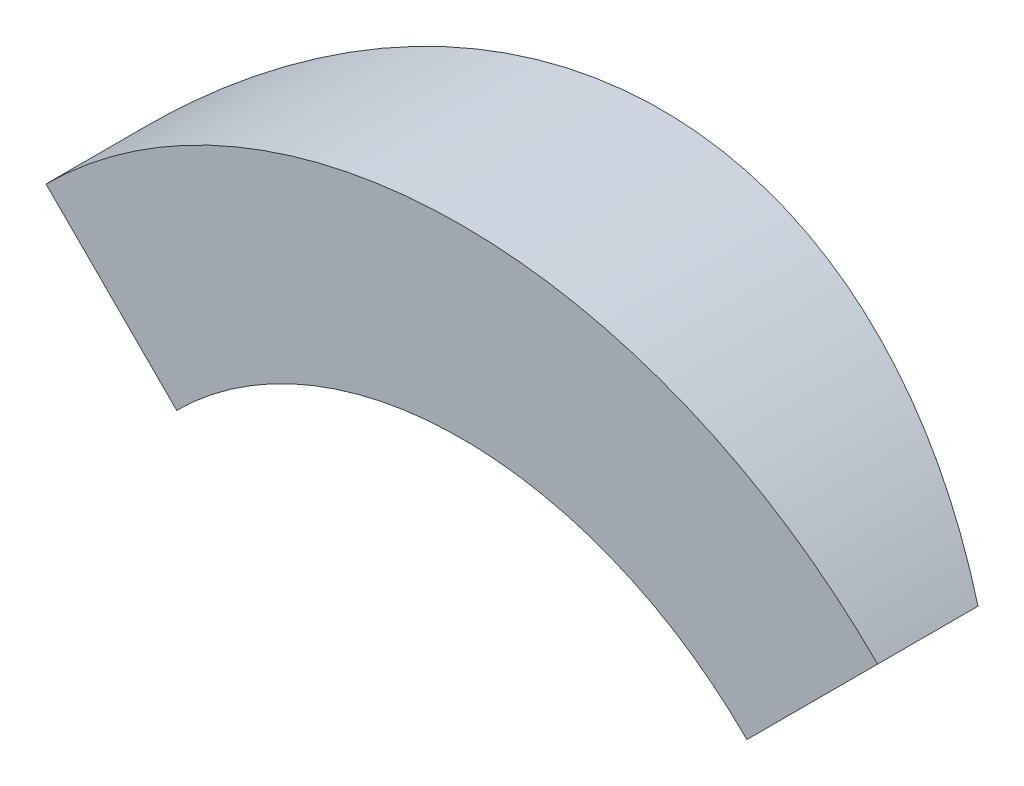
ISO-10303-21;
HEADER;
FILE_DESCRIPTION(('STEP AP214'),'2;1');
FILE_NAME('part.step','',(''),(''),'','','');
FILE_SCHEMA(('AUTOMOTIVE_DESIGN { 1 0 10303 214 1 1 1 1 }'));
ENDSEC;
DATA;
#1=APPLICATION_CONTEXT('core data for automotive mechanical design processes');
#2=APPLICATION_PROTOCOL_DEFINITION('international standard','automotive_design',2000,#1);
#3=PRODUCT_CONTEXT('',#1,'mechanical');
#4=PRODUCT('Part','Part','',(#3));
#5=PRODUCT_RELATED_PRODUCT_CATEGORY('part','',(#4));
#6=PRODUCT_DEFINITION_FORMATION('','',#4);
#7=PRODUCT_DEFINITION_CONTEXT('part definition',#1,'design');
#8=PRODUCT_DEFINITION('design','',#6,#7);
#9=PRODUCT_DEFINITION_SHAPE('','',#8);
#10=(LENGTH_UNIT() NAMED_UNIT(*) SI_UNIT(.MILLI.,.METRE.));
#11=(NAMED_UNIT(*) PLANE_ANGLE_UNIT() SI_UNIT($,.RADIAN.));
#12=(NAMED_UNIT(*) SI_UNIT($,.STERADIAN.) SOLID_ANGLE_UNIT());
#13=UNCERTAINTY_MEASURE_WITH_UNIT(LENGTH_MEASURE(1.E-05),#10,'distance_accuracy_value','');
#14=(GEOMETRIC_REPRESENTATION_CONTEXT(3) GLOBAL_UNCERTAINTY_ASSIGNED_CONTEXT((#13)) GLOBAL_UNIT_ASSIGNED_CONTEXT((#10,
#11,#12)) REPRESENTATION_CONTEXT('',''));
#15=CARTESIAN_POINT('',(0.,0.,0.));
#16=DIRECTION('',(0.,0.,1.));
#17=DIRECTION('',(1.,0.,0.));
#18=AXIS2_PLACEMENT_3D('',#15,#16,#17);
#19=CARTESIAN_POINT('',(0.,1.8,3.11769145362398));
#20=DIRECTION('',(0.,0.500000000000001,0.866025403784438));
#21=DIRECTION('',(0.,-0.866025403784438,0.500000000000001));
#22=AXIS2_PLACEMENT_3D('',#19,#20,#21);
#23=PLANE('',#22);
#24=CARTESIAN_POINT('',(0.,0.,4.1569219381653));
#25=DIRECTION('',(0.,0.500000000000001,0.866025403784438));
#26=DIRECTION('',(0.,-0.866025403784438,0.500000000000001));
#27=AXIS2_PLACEMENT_3D('',#24,#25,#26);
#28=ELLIPSE('',#27,20.2072594216369,17.5);
#29=CARTESIAN_POINT('',(-12.3743686707646,12.3743686707646,-2.98742314495231));
#30=VERTEX_POINT('',#29);
#31=CARTESIAN_POINT('',(12.3743686707646,12.3743686707646,-2.98742314495231));
#32=VERTEX_POINT('',#31);
#33=EDGE_CURVE('E84',#30,#32,#28,.F.);
#34=ORIENTED_EDGE('',*,*,#33,.T.);
#35=DIRECTION('',(-0.654653670707977,-0.654653670707977,0.377964473009228));
#36=VECTOR('',#35,1.);
#37=CARTESIAN_POINT('',(1.02857142857143,1.02857142857143,3.56307594699883));
#38=LINE('',#37,#36);
#39=CARTESIAN_POINT('',(8.48528137423857,8.48528137423857,-0.742057547401059));
#40=VERTEX_POINT('',#39);
#41=EDGE_CURVE('E92',#32,#40,#38,.T.);
#42=ORIENTED_EDGE('',*,*,#41,.T.);
#43=CARTESIAN_POINT('',(0.,0.,4.1569219381653));
#44=DIRECTION('',(0.,0.500000000000001,0.866025403784438));
#45=DIRECTION('',(0.,-0.866025403784438,0.500000000000001));
#46=AXIS2_PLACEMENT_3D('',#43,#44,#45);
#47=ELLIPSE('',#46,13.856406460551,12.);
#48=CARTESIAN_POINT('',(-8.48528137423857,8.48528137423857,-0.742057547401059));
#49=VERTEX_POINT('',#48);
#50=EDGE_CURVE('E77',#40,#49,#47,.T.);
#51=ORIENTED_EDGE('',*,*,#50,.T.);
#52=DIRECTION('',(-0.654653670707977,0.654653670707977,-0.377964473009228));
#53=VECTOR('',#52,1.);
#54=CARTESIAN_POINT('',(-1.02857142857143,1.02857142857143,3.56307594699883));
#55=LINE('',#54,#53);
#56=EDGE_CURVE('E86',#49,#30,#55,.T.);
#57=ORIENTED_EDGE('',*,*,#56,.T.);
#58=EDGE_LOOP('',(#34,#42,#51,#57));
#59=FACE_BOUND('',#58,.T.);
#60=ADVANCED_FACE('F33',(#59),#23,.F.);
#61=CARTESIAN_POINT('',(0.,0.,-160.));
#62=DIRECTION('',(0.,0.,1.));
#63=DIRECTION('',(1.,0.,0.));
#64=AXIS2_PLACEMENT_3D('',#61,#62,#63);
#65=CYLINDRICAL_SURFACE('',#64,17.5);
#66=DIRECTION('',(0.,0.,1.));
#67=VECTOR('',#66,1.);
#68=CARTESIAN_POINT('',(12.3743686707646,12.3743686707646,-160.));
#69=LINE('',#68,#67);
#70=CARTESIAN_POINT('',(12.3743686707646,12.3743686707646,0.));
#71=VERTEX_POINT('',#70);
#72=EDGE_CURVE('E54',#32,#71,#69,.T.);
#73=ORIENTED_EDGE('',*,*,#72,.F.);
#74=ORIENTED_EDGE('',*,*,#33,.F.);
#75=DIRECTION('',(0.,0.,1.));
#76=VECTOR('',#75,1.);
#77=CARTESIAN_POINT('',(-12.3743686707646,12.3743686707646,-160.));
#78=LINE('',#77,#76);
#79=CARTESIAN_POINT('',(-12.3743686707646,12.3743686707646,0.));
#80=VERTEX_POINT('',#79);
#81=EDGE_CURVE('E71',#80,#30,#78,.F.);
#82=ORIENTED_EDGE('',*,*,#81,.F.);
#83=CARTESIAN_POINT('',(0.,0.,0.));
#84=DIRECTION('',(0.,0.,1.));
#85=DIRECTION('',(1.,0.,0.));
#86=AXIS2_PLACEMENT_3D('',#83,#84,#85);
#87=CIRCLE('',#86,17.5);
#88=EDGE_CURVE('E82',#71,#80,#87,.T.);
#89=ORIENTED_EDGE('',*,*,#88,.F.);
#90=EDGE_LOOP('',(#73,#74,#82,#89));
#91=FACE_BOUND('',#90,.T.);
#92=ADVANCED_FACE('F81',(#91),#65,.T.);
#93=CARTESIAN_POINT('',(0.,0.,-160.));
#94=DIRECTION('',(0.,0.,1.));
#95=DIRECTION('',(1.,0.,0.));
#96=AXIS2_PLACEMENT_3D('',#93,#94,#95);
#97=CYLINDRICAL_SURFACE('',#96,12.);
#98=DIRECTION('',(0.,0.,1.));
#99=VECTOR('',#98,1.);
#100=CARTESIAN_POINT('',(8.48528137423857,8.48528137423857,-160.));
#101=LINE('',#100,#99);
#102=CARTESIAN_POINT('',(8.48528137423857,8.48528137423857,0.));
#103=VERTEX_POINT('',#102);
#104=EDGE_CURVE('E85',#103,#40,#101,.F.);
#105=ORIENTED_EDGE('',*,*,#104,.F.);
#106=CARTESIAN_POINT('',(0.,0.,0.));
#107=DIRECTION('',(0.,0.,-1.));
#108=DIRECTION('',(1.,0.,0.));
#109=AXIS2_PLACEMENT_3D('',#106,#107,#108);
#110=CIRCLE('',#109,12.);
#111=CARTESIAN_POINT('',(-8.48528137423857,8.48528137423857,0.));
#112=VERTEX_POINT('',#111);
#113=EDGE_CURVE('E89',#112,#103,#110,.T.);
#114=ORIENTED_EDGE('',*,*,#113,.F.);
#115=DIRECTION('',(0.,0.,1.));
#116=VECTOR('',#115,1.);
#117=CARTESIAN_POINT('',(-8.48528137423857,8.48528137423857,-160.));
#118=LINE('',#117,#116);
#119=EDGE_CURVE('E47',#49,#112,#118,.T.);
#120=ORIENTED_EDGE('',*,*,#119,.F.);
#121=ORIENTED_EDGE('',*,*,#50,.F.);
#122=EDGE_LOOP('',(#105,#114,#120,#121));
#123=FACE_BOUND('',#122,.T.);
#124=ADVANCED_FACE('F107',(#123),#97,.F.);
#125=CARTESIAN_POINT('',(0.,0.,0.));
#126=DIRECTION('',(0.,0.,1.));
#127=DIRECTION('',(1.,0.,0.));
#128=AXIS2_PLACEMENT_3D('',#125,#126,#127);
#129=PLANE('',#128);
#130=DIRECTION('',(-0.707106781186548,-0.707106781186547,0.));
#131=VECTOR('',#130,1.);
#132=CARTESIAN_POINT('',(0.,0.,0.));
#133=LINE('',#132,#131);
#134=EDGE_CURVE('E11',#71,#103,#133,.T.);
#135=ORIENTED_EDGE('',*,*,#134,.F.);
#136=ORIENTED_EDGE('',*,*,#88,.T.);
#137=DIRECTION('',(-0.707106781186548,0.707106781186547,0.));
#138=VECTOR('',#137,1.);
#139=CARTESIAN_POINT('',(0.,0.,0.));
#140=LINE('',#139,#138);
#141=EDGE_CURVE('E40',#112,#80,#140,.T.);
#142=ORIENTED_EDGE('',*,*,#141,.F.);
#143=ORIENTED_EDGE('',*,*,#113,.T.);
#144=EDGE_LOOP('',(#135,#136,#142,#143));
#145=FACE_BOUND('',#144,.T.);
#146=ADVANCED_FACE('F88',(#145),#129,.T.);
#147=CARTESIAN_POINT('',(0.,0.,-5.94670777265318));
#148=DIRECTION('',(0.707106781186547,0.707106781186548,0.));
#149=DIRECTION('',(-0.707106781186548,0.707106781186547,0.));
#150=AXIS2_PLACEMENT_3D('',#147,#148,#149);
#151=PLANE('',#150);
#152=ORIENTED_EDGE('',*,*,#81,.T.);
#153=ORIENTED_EDGE('',*,*,#56,.F.);
#154=ORIENTED_EDGE('',*,*,#119,.T.);
#155=ORIENTED_EDGE('',*,*,#141,.T.);
#156=EDGE_LOOP('',(#152,#153,#154,#155));
#157=FACE_BOUND('',#156,.T.);
#158=ADVANCED_FACE('F70',(#157),#151,.F.);
#159=CARTESIAN_POINT('',(15.9502351079851,15.9502351079851,-5.94670777265318));
#160=DIRECTION('',(-0.707106781186547,0.707106781186548,0.));
#161=DIRECTION('',(-0.707106781186548,-0.707106781186547,0.));
#162=AXIS2_PLACEMENT_3D('',#159,#160,#161);
#163=PLANE('',#162);
#164=ORIENTED_EDGE('',*,*,#72,.T.);
#165=ORIENTED_EDGE('',*,*,#134,.T.);
#166=ORIENTED_EDGE('',*,*,#104,.T.);
#167=ORIENTED_EDGE('',*,*,#41,.F.);
#168=EDGE_LOOP('',(#164,#165,#166,#167));
#169=FACE_BOUND('',#168,.T.);
#170=ADVANCED_FACE('F105',(#169),#163,.F.);
#171=CLOSED_SHELL('',(#60,#92,#124,#146,#158,#170));
#172=MANIFOLD_SOLID_BREP('B2',#171);
#173=ADVANCED_BREP_SHAPE_REPRESENTATION('',(#18,#172),#14);
#174=SHAPE_DEFINITION_REPRESENTATION(#9,#173);
ENDSEC;
END-ISO-10303-21;
